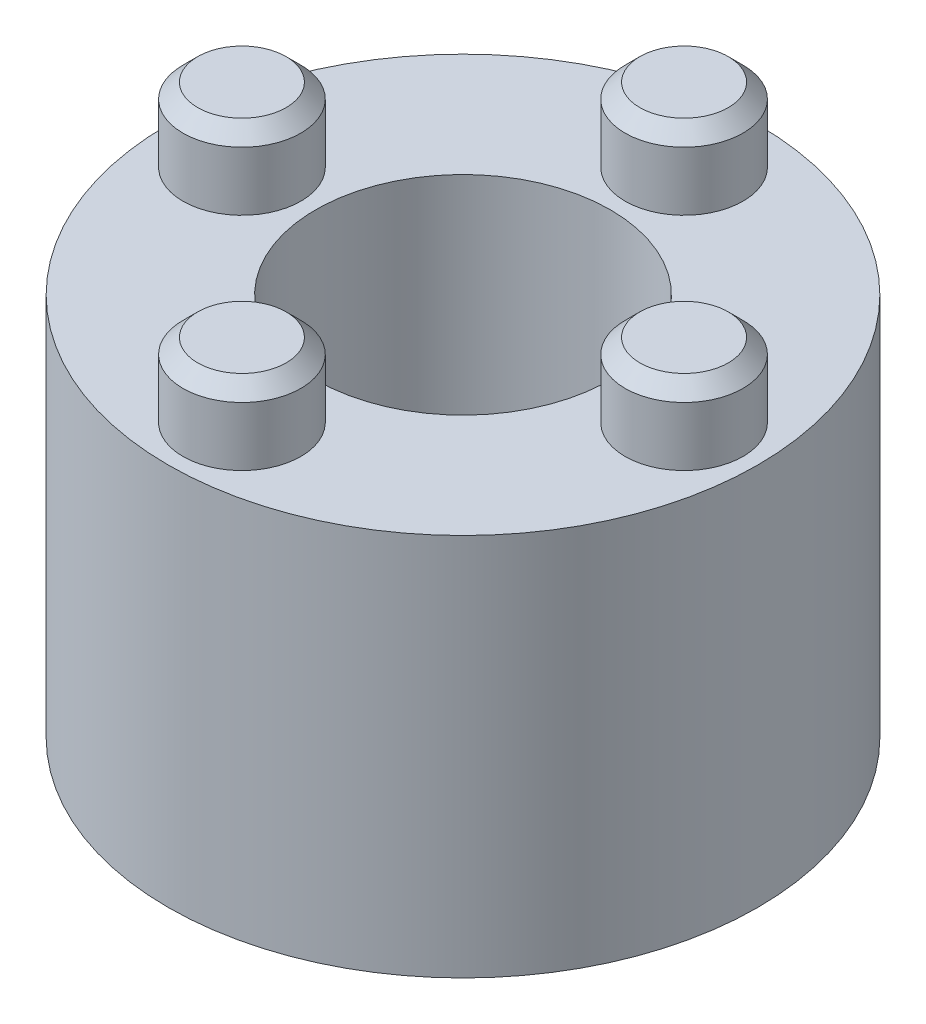
ISO-10303-21;
HEADER;
FILE_DESCRIPTION(('STEP AP214'),'2;1');
FILE_NAME('part.step','',(''),(''),'','','');
FILE_SCHEMA(('AUTOMOTIVE_DESIGN { 1 0 10303 214 1 1 1 1 }'));
ENDSEC;
DATA;
#1=APPLICATION_CONTEXT('core data for automotive mechanical design processes');
#2=APPLICATION_PROTOCOL_DEFINITION('international standard','automotive_design',2000,#1);
#3=PRODUCT_CONTEXT('',#1,'mechanical');
#4=PRODUCT('Part','Part','',(#3));
#5=PRODUCT_RELATED_PRODUCT_CATEGORY('part','',(#4));
#6=PRODUCT_DEFINITION_FORMATION('','',#4);
#7=PRODUCT_DEFINITION_CONTEXT('part definition',#1,'design');
#8=PRODUCT_DEFINITION('design','',#6,#7);
#9=PRODUCT_DEFINITION_SHAPE('','',#8);
#10=(LENGTH_UNIT() NAMED_UNIT(*) SI_UNIT(.MILLI.,.METRE.));
#11=(NAMED_UNIT(*) PLANE_ANGLE_UNIT() SI_UNIT($,.RADIAN.));
#12=(NAMED_UNIT(*) SI_UNIT($,.STERADIAN.) SOLID_ANGLE_UNIT());
#13=UNCERTAINTY_MEASURE_WITH_UNIT(LENGTH_MEASURE(1.E-05),#10,'distance_accuracy_value','');
#14=(GEOMETRIC_REPRESENTATION_CONTEXT(3) GLOBAL_UNCERTAINTY_ASSIGNED_CONTEXT((#13)) GLOBAL_UNIT_ASSIGNED_CONTEXT((#10,
#11,#12)) REPRESENTATION_CONTEXT('',''));
#15=CARTESIAN_POINT('',(0.,0.,0.));
#16=DIRECTION('',(0.,0.,1.));
#17=DIRECTION('',(1.,0.,0.));
#18=AXIS2_PLACEMENT_3D('',#15,#16,#17);
#19=CARTESIAN_POINT('',(0.,13.,0.));
#20=DIRECTION('',(0.,1.,0.));
#21=DIRECTION('',(0.,0.,1.));
#22=AXIS2_PLACEMENT_3D('',#19,#20,#21);
#23=PLANE('',#22);
#24=CARTESIAN_POINT('',(-7.5,13.,0.));
#25=DIRECTION('',(0.,1.,0.));
#26=DIRECTION('',(0.,0.,1.));
#27=AXIS2_PLACEMENT_3D('',#24,#25,#26);
#28=CIRCLE('',#27,2.00000000000014);
#29=CARTESIAN_POINT('',(-7.5,13.,2.00000000000014));
#30=VERTEX_POINT('',#29);
#31=EDGE_CURVE('E90',#30,#30,#28,.T.);
#32=ORIENTED_EDGE('',*,*,#31,.F.);
#33=EDGE_LOOP('',(#32));
#34=FACE_BOUND('',#33,.T.);
#35=CARTESIAN_POINT('',(0.,13.,7.5));
#36=DIRECTION('',(0.,1.,0.));
#37=DIRECTION('',(0.,0.,1.));
#38=AXIS2_PLACEMENT_3D('',#35,#36,#37);
#39=CIRCLE('',#38,2.0000000000004);
#40=CARTESIAN_POINT('',(0.,13.,9.5000000000004));
#41=VERTEX_POINT('',#40);
#42=EDGE_CURVE('E87',#41,#41,#39,.T.);
#43=ORIENTED_EDGE('',*,*,#42,.F.);
#44=EDGE_LOOP('',(#43));
#45=FACE_BOUND('',#44,.T.);
#46=CARTESIAN_POINT('',(7.5,13.,0.));
#47=DIRECTION('',(0.,1.,0.));
#48=DIRECTION('',(0.,0.,1.));
#49=AXIS2_PLACEMENT_3D('',#46,#47,#48);
#50=CIRCLE('',#49,2.00000000000026);
#51=CARTESIAN_POINT('',(7.5,13.,2.00000000000026));
#52=VERTEX_POINT('',#51);
#53=EDGE_CURVE('E84',#52,#52,#50,.T.);
#54=ORIENTED_EDGE('',*,*,#53,.F.);
#55=EDGE_LOOP('',(#54));
#56=FACE_BOUND('',#55,.T.);
#57=CARTESIAN_POINT('',(0.,13.,-7.5));
#58=DIRECTION('',(0.,1.,0.));
#59=DIRECTION('',(0.,0.,1.));
#60=AXIS2_PLACEMENT_3D('',#57,#58,#59);
#61=CIRCLE('',#60,2.);
#62=CARTESIAN_POINT('',(0.,13.,-5.5));
#63=VERTEX_POINT('',#62);
#64=EDGE_CURVE('E79',#63,#63,#61,.T.);
#65=ORIENTED_EDGE('',*,*,#64,.F.);
#66=EDGE_LOOP('',(#65));
#67=FACE_BOUND('',#66,.T.);
#68=CARTESIAN_POINT('',(0.,13.,0.));
#69=DIRECTION('',(0.,1.,0.));
#70=DIRECTION('',(0.,0.,1.));
#71=AXIS2_PLACEMENT_3D('',#68,#69,#70);
#72=CIRCLE('',#71,10.);
#73=CARTESIAN_POINT('',(0.,13.,-10.));
#74=VERTEX_POINT('',#73);
#75=EDGE_CURVE('E69',#74,#74,#72,.T.);
#76=ORIENTED_EDGE('',*,*,#75,.T.);
#77=EDGE_LOOP('',(#76));
#78=FACE_BOUND('',#77,.T.);
#79=CARTESIAN_POINT('',(0.,13.,0.));
#80=DIRECTION('',(0.,1.,0.));
#81=DIRECTION('',(0.,0.,1.));
#82=AXIS2_PLACEMENT_3D('',#79,#80,#81);
#83=CIRCLE('',#82,5.);
#84=CARTESIAN_POINT('',(0.,13.,-5.));
#85=VERTEX_POINT('',#84);
#86=EDGE_CURVE('E73',#85,#85,#83,.T.);
#87=ORIENTED_EDGE('',*,*,#86,.F.);
#88=EDGE_LOOP('',(#87));
#89=FACE_BOUND('',#88,.T.);
#90=ADVANCED_FACE('F36',(#34,#45,#56,#67,#78,#89),#23,.T.);
#91=CARTESIAN_POINT('',(0.,0.,0.));
#92=DIRECTION('',(0.,1.,0.));
#93=DIRECTION('',(0.,0.,1.));
#94=AXIS2_PLACEMENT_3D('',#91,#92,#93);
#95=PLANE('',#94);
#96=CARTESIAN_POINT('',(0.,0.,0.));
#97=DIRECTION('',(0.,1.,0.));
#98=DIRECTION('',(0.,0.,1.));
#99=AXIS2_PLACEMENT_3D('',#96,#97,#98);
#100=CIRCLE('',#99,10.);
#101=CARTESIAN_POINT('',(0.,0.,-10.));
#102=VERTEX_POINT('',#101);
#103=EDGE_CURVE('E70',#102,#102,#100,.T.);
#104=ORIENTED_EDGE('',*,*,#103,.F.);
#105=EDGE_LOOP('',(#104));
#106=FACE_BOUND('',#105,.T.);
#107=CARTESIAN_POINT('',(0.,0.,0.));
#108=DIRECTION('',(0.,1.,0.));
#109=DIRECTION('',(0.,0.,1.));
#110=AXIS2_PLACEMENT_3D('',#107,#108,#109);
#111=CIRCLE('',#110,5.);
#112=CARTESIAN_POINT('',(0.,0.,-5.));
#113=VERTEX_POINT('',#112);
#114=EDGE_CURVE('E76',#113,#113,#111,.T.);
#115=ORIENTED_EDGE('',*,*,#114,.T.);
#116=EDGE_LOOP('',(#115));
#117=FACE_BOUND('',#116,.T.);
#118=ADVANCED_FACE('F98',(#106,#117),#95,.F.);
#119=CARTESIAN_POINT('',(0.,13.,0.));
#120=DIRECTION('',(0.,-1.,0.));
#121=DIRECTION('',(0.,0.,-1.));
#122=AXIS2_PLACEMENT_3D('',#119,#120,#121);
#123=CYLINDRICAL_SURFACE('',#122,10.);
#124=CARTESIAN_POINT('',(0.,13.,-10.));
#125=CARTESIAN_POINT('',(0.,12.8645833333333,-10.));
#126=CARTESIAN_POINT('',(0.,12.7291666666667,-10.));
#127=CARTESIAN_POINT('',(0.,12.4583333333333,-10.));
#128=CARTESIAN_POINT('',(0.,12.3229166666667,-10.));
#129=CARTESIAN_POINT('',(0.,12.0520833333333,-10.));
#130=CARTESIAN_POINT('',(0.,11.9166666666667,-10.));
#131=CARTESIAN_POINT('',(0.,11.6458333333333,-10.));
#132=CARTESIAN_POINT('',(0.,11.5104166666667,-10.));
#133=CARTESIAN_POINT('',(0.,11.2395833333333,-10.));
#134=CARTESIAN_POINT('',(0.,11.1041666666667,-10.));
#135=CARTESIAN_POINT('',(0.,10.8333333333333,-10.));
#136=CARTESIAN_POINT('',(0.,10.6979166666667,-10.));
#137=CARTESIAN_POINT('',(0.,10.4270833333333,-10.));
#138=CARTESIAN_POINT('',(0.,10.2916666666667,-10.));
#139=CARTESIAN_POINT('',(0.,10.0208333333333,-10.));
#140=CARTESIAN_POINT('',(0.,9.88541666666667,-10.));
#141=CARTESIAN_POINT('',(0.,9.61458333333333,-10.));
#142=CARTESIAN_POINT('',(0.,9.47916666666667,-10.));
#143=CARTESIAN_POINT('',(0.,9.20833333333333,-10.));
#144=CARTESIAN_POINT('',(0.,9.07291666666666,-10.));
#145=CARTESIAN_POINT('',(0.,8.80208333333333,-10.));
#146=CARTESIAN_POINT('',(0.,8.66666666666667,-10.));
#147=CARTESIAN_POINT('',(0.,8.39583333333333,-10.));
#148=CARTESIAN_POINT('',(0.,8.26041666666667,-10.));
#149=CARTESIAN_POINT('',(0.,7.98958333333333,-10.));
#150=CARTESIAN_POINT('',(0.,7.85416666666667,-10.));
#151=CARTESIAN_POINT('',(0.,7.58333333333333,-10.));
#152=CARTESIAN_POINT('',(0.,7.44791666666667,-10.));
#153=CARTESIAN_POINT('',(0.,7.17708333333333,-10.));
#154=CARTESIAN_POINT('',(0.,7.04166666666667,-10.));
#155=CARTESIAN_POINT('',(0.,6.77083333333333,-10.));
#156=CARTESIAN_POINT('',(0.,6.63541666666667,-10.));
#157=CARTESIAN_POINT('',(0.,6.36458333333333,-10.));
#158=CARTESIAN_POINT('',(0.,6.22916666666667,-10.));
#159=CARTESIAN_POINT('',(0.,5.95833333333333,-10.));
#160=CARTESIAN_POINT('',(0.,5.82291666666667,-10.));
#161=CARTESIAN_POINT('',(0.,5.55208333333333,-10.));
#162=CARTESIAN_POINT('',(0.,5.41666666666667,-10.));
#163=CARTESIAN_POINT('',(0.,5.14583333333333,-10.));
#164=CARTESIAN_POINT('',(0.,5.01041666666667,-10.));
#165=CARTESIAN_POINT('',(0.,4.73958333333333,-10.));
#166=CARTESIAN_POINT('',(0.,4.60416666666667,-10.));
#167=CARTESIAN_POINT('',(0.,4.33333333333333,-10.));
#168=CARTESIAN_POINT('',(0.,4.19791666666667,-10.));
#169=CARTESIAN_POINT('',(0.,3.92708333333333,-10.));
#170=CARTESIAN_POINT('',(0.,3.79166666666667,-10.));
#171=CARTESIAN_POINT('',(0.,3.52083333333333,-10.));
#172=CARTESIAN_POINT('',(0.,3.38541666666667,-10.));
#173=CARTESIAN_POINT('',(0.,3.11458333333333,-10.));
#174=CARTESIAN_POINT('',(0.,2.97916666666667,-10.));
#175=CARTESIAN_POINT('',(0.,2.70833333333333,-10.));
#176=CARTESIAN_POINT('',(0.,2.57291666666667,-10.));
#177=CARTESIAN_POINT('',(0.,2.30208333333333,-10.));
#178=CARTESIAN_POINT('',(0.,2.16666666666667,-10.));
#179=CARTESIAN_POINT('',(0.,1.89583333333333,-10.));
#180=CARTESIAN_POINT('',(0.,1.76041666666667,-10.));
#181=CARTESIAN_POINT('',(0.,1.48958333333333,-10.));
#182=CARTESIAN_POINT('',(0.,1.35416666666667,-10.));
#183=CARTESIAN_POINT('',(0.,1.08333333333333,-10.));
#184=CARTESIAN_POINT('',(0.,0.947916666666667,-10.));
#185=CARTESIAN_POINT('',(0.,0.677083333333334,-10.));
#186=CARTESIAN_POINT('',(0.,0.541666666666667,-10.));
#187=CARTESIAN_POINT('',(0.,0.270833333333334,-10.));
#188=CARTESIAN_POINT('',(0.,0.135416666666667,-10.));
#189=CARTESIAN_POINT('',(0.,0.,-10.));
#190=B_SPLINE_CURVE_WITH_KNOTS('',3,(#124,#125,#126,#127,#128,#129,#130,#131,#132,#133,#134,
#135,#136,#137,#138,#139,#140,#141,#142,#143,#144,#145,#146,#147,#148,#149,#150,#151,#152,#153,
#154,#155,#156,#157,#158,#159,#160,#161,#162,#163,#164,#165,#166,#167,#168,#169,#170,#171,#172,
#173,#174,#175,#176,#177,#178,#179,#180,#181,#182,#183,#184,#185,#186,#187,#188,#189),
.UNSPECIFIED.,.F.,.F.,(4,2,2,2,2,2,2,2,2,2,2,2,2,2,2,2,2,2,2,2,2,2,2,2,2,2,2,2,2,2,2,2,4),(0.,
0.40625,0.812500000000001,1.21875,1.625,2.03125,2.4375,2.84375,3.25,3.65625,4.0625,4.46875,
4.875,5.28125,5.6875,6.09375,6.5,6.90625,7.3125,7.71875,8.125,8.53125,8.9375,9.34375,9.75,
10.15625,10.5625,10.96875,11.375,11.78125,12.1875,12.59375,13.),.UNSPECIFIED.);
#191=EDGE_CURVE('BSEAM114',#74,#102,#190,.T.);
#192=ORIENTED_EDGE('',*,*,#75,.F.);
#193=ORIENTED_EDGE('',*,*,#103,.T.);
#194=ORIENTED_EDGE('',*,*,#191,.T.);
#195=ORIENTED_EDGE('',*,*,#191,.F.);
#196=EDGE_LOOP('',(#192,#194,#193,#195));
#197=FACE_BOUND('',#196,.T.);
#198=ADVANCED_FACE('F114',(#197),#123,.T.);
#199=CARTESIAN_POINT('',(0.,13.,0.));
#200=DIRECTION('',(0.,-1.,0.));
#201=DIRECTION('',(0.,0.,-1.));
#202=AXIS2_PLACEMENT_3D('',#199,#200,#201);
#203=CYLINDRICAL_SURFACE('',#202,5.);
#204=CARTESIAN_POINT('',(0.,13.,-5.));
#205=CARTESIAN_POINT('',(0.,12.8645833333333,-5.));
#206=CARTESIAN_POINT('',(0.,12.7291666666667,-5.));
#207=CARTESIAN_POINT('',(0.,12.4583333333333,-5.));
#208=CARTESIAN_POINT('',(0.,12.3229166666667,-5.));
#209=CARTESIAN_POINT('',(0.,12.0520833333333,-5.));
#210=CARTESIAN_POINT('',(0.,11.9166666666667,-5.));
#211=CARTESIAN_POINT('',(0.,11.6458333333333,-5.));
#212=CARTESIAN_POINT('',(0.,11.5104166666667,-5.));
#213=CARTESIAN_POINT('',(0.,11.2395833333333,-5.));
#214=CARTESIAN_POINT('',(0.,11.1041666666667,-5.));
#215=CARTESIAN_POINT('',(0.,10.8333333333333,-5.));
#216=CARTESIAN_POINT('',(0.,10.6979166666667,-5.));
#217=CARTESIAN_POINT('',(0.,10.4270833333333,-5.));
#218=CARTESIAN_POINT('',(0.,10.2916666666667,-5.));
#219=CARTESIAN_POINT('',(0.,10.0208333333333,-5.));
#220=CARTESIAN_POINT('',(0.,9.88541666666667,-5.));
#221=CARTESIAN_POINT('',(0.,9.61458333333333,-5.));
#222=CARTESIAN_POINT('',(0.,9.47916666666667,-5.));
#223=CARTESIAN_POINT('',(0.,9.20833333333333,-5.));
#224=CARTESIAN_POINT('',(0.,9.07291666666667,-5.));
#225=CARTESIAN_POINT('',(0.,8.80208333333333,-5.));
#226=CARTESIAN_POINT('',(0.,8.66666666666667,-5.));
#227=CARTESIAN_POINT('',(0.,8.39583333333333,-5.));
#228=CARTESIAN_POINT('',(0.,8.26041666666667,-5.));
#229=CARTESIAN_POINT('',(0.,7.98958333333333,-5.));
#230=CARTESIAN_POINT('',(0.,7.85416666666667,-5.));
#231=CARTESIAN_POINT('',(0.,7.58333333333333,-5.));
#232=CARTESIAN_POINT('',(0.,7.44791666666667,-5.));
#233=CARTESIAN_POINT('',(0.,7.17708333333333,-5.));
#234=CARTESIAN_POINT('',(0.,7.04166666666667,-5.));
#235=CARTESIAN_POINT('',(0.,6.77083333333333,-5.));
#236=CARTESIAN_POINT('',(0.,6.63541666666667,-5.));
#237=CARTESIAN_POINT('',(0.,6.36458333333333,-5.));
#238=CARTESIAN_POINT('',(0.,6.22916666666667,-5.));
#239=CARTESIAN_POINT('',(0.,5.95833333333333,-5.));
#240=CARTESIAN_POINT('',(0.,5.82291666666667,-5.));
#241=CARTESIAN_POINT('',(0.,5.55208333333333,-5.));
#242=CARTESIAN_POINT('',(0.,5.41666666666667,-5.));
#243=CARTESIAN_POINT('',(0.,5.14583333333333,-5.));
#244=CARTESIAN_POINT('',(0.,5.01041666666667,-5.));
#245=CARTESIAN_POINT('',(0.,4.73958333333333,-5.));
#246=CARTESIAN_POINT('',(0.,4.60416666666667,-5.));
#247=CARTESIAN_POINT('',(0.,4.33333333333333,-5.));
#248=CARTESIAN_POINT('',(0.,4.19791666666667,-5.));
#249=CARTESIAN_POINT('',(0.,3.92708333333333,-5.));
#250=CARTESIAN_POINT('',(0.,3.79166666666667,-5.));
#251=CARTESIAN_POINT('',(0.,3.52083333333333,-5.));
#252=CARTESIAN_POINT('',(0.,3.38541666666667,-5.));
#253=CARTESIAN_POINT('',(0.,3.11458333333333,-5.));
#254=CARTESIAN_POINT('',(0.,2.97916666666667,-5.));
#255=CARTESIAN_POINT('',(0.,2.70833333333333,-5.));
#256=CARTESIAN_POINT('',(0.,2.57291666666667,-5.));
#257=CARTESIAN_POINT('',(0.,2.30208333333333,-5.));
#258=CARTESIAN_POINT('',(0.,2.16666666666667,-5.));
#259=CARTESIAN_POINT('',(0.,1.89583333333333,-5.));
#260=CARTESIAN_POINT('',(0.,1.76041666666667,-5.));
#261=CARTESIAN_POINT('',(0.,1.48958333333333,-5.));
#262=CARTESIAN_POINT('',(0.,1.35416666666667,-5.));
#263=CARTESIAN_POINT('',(0.,1.08333333333333,-5.));
#264=CARTESIAN_POINT('',(0.,0.947916666666667,-5.));
#265=CARTESIAN_POINT('',(0.,0.677083333333334,-5.));
#266=CARTESIAN_POINT('',(0.,0.541666666666667,-5.));
#267=CARTESIAN_POINT('',(0.,0.270833333333334,-5.));
#268=CARTESIAN_POINT('',(0.,0.135416666666667,-5.));
#269=CARTESIAN_POINT('',(0.,0.,-5.));
#270=B_SPLINE_CURVE_WITH_KNOTS('',3,(#204,#205,#206,#207,#208,#209,#210,#211,#212,#213,#214,
#215,#216,#217,#218,#219,#220,#221,#222,#223,#224,#225,#226,#227,#228,#229,#230,#231,#232,#233,
#234,#235,#236,#237,#238,#239,#240,#241,#242,#243,#244,#245,#246,#247,#248,#249,#250,#251,#252,
#253,#254,#255,#256,#257,#258,#259,#260,#261,#262,#263,#264,#265,#266,#267,#268,#269),
.UNSPECIFIED.,.F.,.F.,(4,2,2,2,2,2,2,2,2,2,2,2,2,2,2,2,2,2,2,2,2,2,2,2,2,2,2,2,2,2,2,2,4),(0.,
0.406249999999999,0.812499999999999,1.21875,1.625,2.03125,2.4375,2.84375,3.25,3.65625,4.0625,
4.46875,4.875,5.28125,5.6875,6.09375,6.5,6.90625,7.3125,7.71875,8.125,8.53125,8.9375,9.34375,
9.75,10.15625,10.5625,10.96875,11.375,11.78125,12.1875,12.59375,13.),.UNSPECIFIED.);
#271=EDGE_CURVE('BSEAM110',#85,#113,#270,.T.);
#272=ORIENTED_EDGE('',*,*,#86,.T.);
#273=ORIENTED_EDGE('',*,*,#114,.F.);
#274=ORIENTED_EDGE('',*,*,#271,.T.);
#275=ORIENTED_EDGE('',*,*,#271,.F.);
#276=EDGE_LOOP('',(#272,#274,#273,#275));
#277=FACE_BOUND('',#276,.T.);
#278=ADVANCED_FACE('F110',(#277),#203,.F.);
#279=CARTESIAN_POINT('',(0.,15.5,-7.5));
#280=DIRECTION('',(0.,-1.,0.));
#281=DIRECTION('',(0.,0.,-1.));
#282=AXIS2_PLACEMENT_3D('',#279,#280,#281);
#283=CYLINDRICAL_SURFACE('',#282,2.);
#284=CARTESIAN_POINT('',(0.,15.,-7.5));
#285=DIRECTION('',(0.,1.,0.));
#286=DIRECTION('',(0.,0.,1.));
#287=AXIS2_PLACEMENT_3D('',#284,#285,#286);
#288=CIRCLE('',#287,2.);
#289=CARTESIAN_POINT('',(0.,15.,-5.5));
#290=VERTEX_POINT('',#289);
#291=EDGE_CURVE('E10',#290,#290,#288,.F.);
#292=ORIENTED_EDGE('',*,*,#291,.T.);
#293=EDGE_LOOP('',(#292));
#294=FACE_BOUND('',#293,.T.);
#295=ORIENTED_EDGE('',*,*,#64,.T.);
#296=EDGE_LOOP('',(#295));
#297=FACE_BOUND('',#296,.T.);
#298=ADVANCED_FACE('F113',(#294,#297),#283,.T.);
#299=CARTESIAN_POINT('',(0.,15.5,-7.5));
#300=DIRECTION('',(0.,1.,0.));
#301=DIRECTION('',(0.,0.,1.));
#302=AXIS2_PLACEMENT_3D('',#299,#300,#301);
#303=PLANE('',#302);
#304=CARTESIAN_POINT('',(0.,15.5,-7.5));
#305=DIRECTION('',(0.,1.,0.));
#306=DIRECTION('',(0.,0.,1.));
#307=AXIS2_PLACEMENT_3D('',#304,#305,#306);
#308=CIRCLE('',#307,1.5);
#309=CARTESIAN_POINT('',(0.,15.5,-6.));
#310=VERTEX_POINT('',#309);
#311=EDGE_CURVE('E44',#310,#310,#308,.T.);
#312=ORIENTED_EDGE('',*,*,#311,.T.);
#313=EDGE_LOOP('',(#312));
#314=FACE_BOUND('',#313,.T.);
#315=ADVANCED_FACE('F179',(#314),#303,.T.);
#316=CARTESIAN_POINT('',(7.5,15.5,0.));
#317=DIRECTION('',(0.,-1.,0.));
#318=DIRECTION('',(0.,0.,-1.));
#319=AXIS2_PLACEMENT_3D('',#316,#317,#318);
#320=CYLINDRICAL_SURFACE('',#319,2.00000000000026);
#321=CARTESIAN_POINT('',(7.5,15.,0.));
#322=DIRECTION('',(0.,1.,0.));
#323=DIRECTION('',(0.,0.,1.));
#324=AXIS2_PLACEMENT_3D('',#321,#322,#323);
#325=CIRCLE('',#324,2.00000000000026);
#326=CARTESIAN_POINT('',(7.5,15.,2.00000000000026));
#327=VERTEX_POINT('',#326);
#328=EDGE_CURVE('E63',#327,#327,#325,.F.);
#329=ORIENTED_EDGE('',*,*,#328,.T.);
#330=EDGE_LOOP('',(#329));
#331=FACE_BOUND('',#330,.T.);
#332=ORIENTED_EDGE('',*,*,#53,.T.);
#333=EDGE_LOOP('',(#332));
#334=FACE_BOUND('',#333,.T.);
#335=ADVANCED_FACE('F175',(#331,#334),#320,.T.);
#336=CARTESIAN_POINT('',(7.5,15.5,0.));
#337=DIRECTION('',(0.,1.,0.));
#338=DIRECTION('',(0.,0.,1.));
#339=AXIS2_PLACEMENT_3D('',#336,#337,#338);
#340=PLANE('',#339);
#341=CARTESIAN_POINT('',(7.5,15.5,0.));
#342=DIRECTION('',(0.,1.,0.));
#343=DIRECTION('',(0.,0.,1.));
#344=AXIS2_PLACEMENT_3D('',#341,#342,#343);
#345=CIRCLE('',#344,1.50000000000027);
#346=CARTESIAN_POINT('',(7.5,15.5,1.50000000000027));
#347=VERTEX_POINT('',#346);
#348=EDGE_CURVE('E66',#347,#347,#345,.T.);
#349=ORIENTED_EDGE('',*,*,#348,.T.);
#350=EDGE_LOOP('',(#349));
#351=FACE_BOUND('',#350,.T.);
#352=ADVANCED_FACE('F171',(#351),#340,.T.);
#353=CARTESIAN_POINT('',(0.,15.5,7.5));
#354=DIRECTION('',(0.,-1.,0.));
#355=DIRECTION('',(0.,0.,-1.));
#356=AXIS2_PLACEMENT_3D('',#353,#354,#355);
#357=CYLINDRICAL_SURFACE('',#356,2.0000000000004);
#358=CARTESIAN_POINT('',(0.,15.,7.5));
#359=DIRECTION('',(0.,1.,0.));
#360=DIRECTION('',(0.,0.,1.));
#361=AXIS2_PLACEMENT_3D('',#358,#359,#360);
#362=CIRCLE('',#361,2.0000000000004);
#363=CARTESIAN_POINT('',(0.,15.,9.5000000000004));
#364=VERTEX_POINT('',#363);
#365=EDGE_CURVE('E57',#364,#364,#362,.F.);
#366=ORIENTED_EDGE('',*,*,#365,.T.);
#367=EDGE_LOOP('',(#366));
#368=FACE_BOUND('',#367,.T.);
#369=ORIENTED_EDGE('',*,*,#42,.T.);
#370=EDGE_LOOP('',(#369));
#371=FACE_BOUND('',#370,.T.);
#372=ADVANCED_FACE('F167',(#368,#371),#357,.T.);
#373=CARTESIAN_POINT('',(0.,15.5,7.5));
#374=DIRECTION('',(0.,1.,0.));
#375=DIRECTION('',(0.,0.,1.));
#376=AXIS2_PLACEMENT_3D('',#373,#374,#375);
#377=PLANE('',#376);
#378=CARTESIAN_POINT('',(0.,15.5,7.5));
#379=DIRECTION('',(0.,1.,0.));
#380=DIRECTION('',(0.,0.,1.));
#381=AXIS2_PLACEMENT_3D('',#378,#379,#380);
#382=CIRCLE('',#381,1.50000000000041);
#383=CARTESIAN_POINT('',(0.,15.5,9.00000000000041));
#384=VERTEX_POINT('',#383);
#385=EDGE_CURVE('E60',#384,#384,#382,.T.);
#386=ORIENTED_EDGE('',*,*,#385,.T.);
#387=EDGE_LOOP('',(#386));
#388=FACE_BOUND('',#387,.T.);
#389=ADVANCED_FACE('F161',(#388),#377,.T.);
#390=CARTESIAN_POINT('',(-7.5,15.5,0.));
#391=DIRECTION('',(0.,-1.,0.));
#392=DIRECTION('',(0.,0.,-1.));
#393=AXIS2_PLACEMENT_3D('',#390,#391,#392);
#394=CYLINDRICAL_SURFACE('',#393,2.00000000000014);
#395=CARTESIAN_POINT('',(-7.5,15.,0.));
#396=DIRECTION('',(0.,1.,0.));
#397=DIRECTION('',(0.,0.,1.));
#398=AXIS2_PLACEMENT_3D('',#395,#396,#397);
#399=CIRCLE('',#398,2.00000000000014);
#400=CARTESIAN_POINT('',(-7.5,15.,2.00000000000014));
#401=VERTEX_POINT('',#400);
#402=EDGE_CURVE('E48',#401,#401,#399,.F.);
#403=ORIENTED_EDGE('',*,*,#402,.T.);
#404=EDGE_LOOP('',(#403));
#405=FACE_BOUND('',#404,.T.);
#406=ORIENTED_EDGE('',*,*,#31,.T.);
#407=EDGE_LOOP('',(#406));
#408=FACE_BOUND('',#407,.T.);
#409=ADVANCED_FACE('F94',(#405,#408),#394,.T.);
#410=CARTESIAN_POINT('',(-7.5,15.5,0.));
#411=DIRECTION('',(0.,1.,0.));
#412=DIRECTION('',(0.,0.,1.));
#413=AXIS2_PLACEMENT_3D('',#410,#411,#412);
#414=PLANE('',#413);
#415=CARTESIAN_POINT('',(-7.5,15.5,0.));
#416=DIRECTION('',(0.,1.,0.));
#417=DIRECTION('',(0.,0.,1.));
#418=AXIS2_PLACEMENT_3D('',#415,#416,#417);
#419=CIRCLE('',#418,1.50000000000014);
#420=CARTESIAN_POINT('',(-7.5,15.5,1.50000000000014));
#421=VERTEX_POINT('',#420);
#422=EDGE_CURVE('E52',#421,#421,#419,.T.);
#423=ORIENTED_EDGE('',*,*,#422,.T.);
#424=EDGE_LOOP('',(#423));
#425=FACE_BOUND('',#424,.T.);
#426=ADVANCED_FACE('F136',(#425),#414,.T.);
#427=CARTESIAN_POINT('',(7.5,15.5,0.));
#428=DIRECTION('',(0.,-1.,0.));
#429=DIRECTION('',(0.,0.,-1.));
#430=AXIS2_PLACEMENT_3D('',#427,#428,#429);
#431=CONICAL_SURFACE('',#430,1.50000000000027,0.785398163397448);
#432=ORIENTED_EDGE('',*,*,#328,.F.);
#433=EDGE_LOOP('',(#432));
#434=FACE_BOUND('',#433,.T.);
#435=ORIENTED_EDGE('',*,*,#348,.F.);
#436=EDGE_LOOP('',(#435));
#437=FACE_BOUND('',#436,.T.);
#438=ADVANCED_FACE('F129',(#434,#437),#431,.T.);
#439=CARTESIAN_POINT('',(0.,15.5,7.5));
#440=DIRECTION('',(0.,-1.,0.));
#441=DIRECTION('',(0.,0.,-1.));
#442=AXIS2_PLACEMENT_3D('',#439,#440,#441);
#443=CONICAL_SURFACE('',#442,1.50000000000041,0.785398163397449);
#444=ORIENTED_EDGE('',*,*,#365,.F.);
#445=EDGE_LOOP('',(#444));
#446=FACE_BOUND('',#445,.T.);
#447=ORIENTED_EDGE('',*,*,#385,.F.);
#448=EDGE_LOOP('',(#447));
#449=FACE_BOUND('',#448,.T.);
#450=ADVANCED_FACE('F135',(#446,#449),#443,.T.);
#451=CARTESIAN_POINT('',(-7.5,15.5,0.));
#452=DIRECTION('',(0.,-1.,0.));
#453=DIRECTION('',(0.,0.,-1.));
#454=AXIS2_PLACEMENT_3D('',#451,#452,#453);
#455=CONICAL_SURFACE('',#454,1.50000000000014,0.785398163397449);
#456=ORIENTED_EDGE('',*,*,#402,.F.);
#457=EDGE_LOOP('',(#456));
#458=FACE_BOUND('',#457,.T.);
#459=ORIENTED_EDGE('',*,*,#422,.F.);
#460=EDGE_LOOP('',(#459));
#461=FACE_BOUND('',#460,.T.);
#462=ADVANCED_FACE('F142',(#458,#461),#455,.T.);
#463=CARTESIAN_POINT('',(0.,15.5,-7.5));
#464=DIRECTION('',(0.,-1.,0.));
#465=DIRECTION('',(0.,0.,-1.));
#466=AXIS2_PLACEMENT_3D('',#463,#464,#465);
#467=CONICAL_SURFACE('',#466,1.5,0.785398163397448);
#468=ORIENTED_EDGE('',*,*,#291,.F.);
#469=EDGE_LOOP('',(#468));
#470=FACE_BOUND('',#469,.T.);
#471=ORIENTED_EDGE('',*,*,#311,.F.);
#472=EDGE_LOOP('',(#471));
#473=FACE_BOUND('',#472,.T.);
#474=ADVANCED_FACE('F39',(#470,#473),#467,.T.);
#475=CLOSED_SHELL('',(#90,#118,#198,#278,#298,#315,#335,#352,#372,#389,#409,#426,#438,#450,#462,#474));
#476=MANIFOLD_SOLID_BREP('B2',#475);
#477=ADVANCED_BREP_SHAPE_REPRESENTATION('',(#18,#476),#14);
#478=SHAPE_DEFINITION_REPRESENTATION(#9,#477);
ENDSEC;
END-ISO-10303-21;
